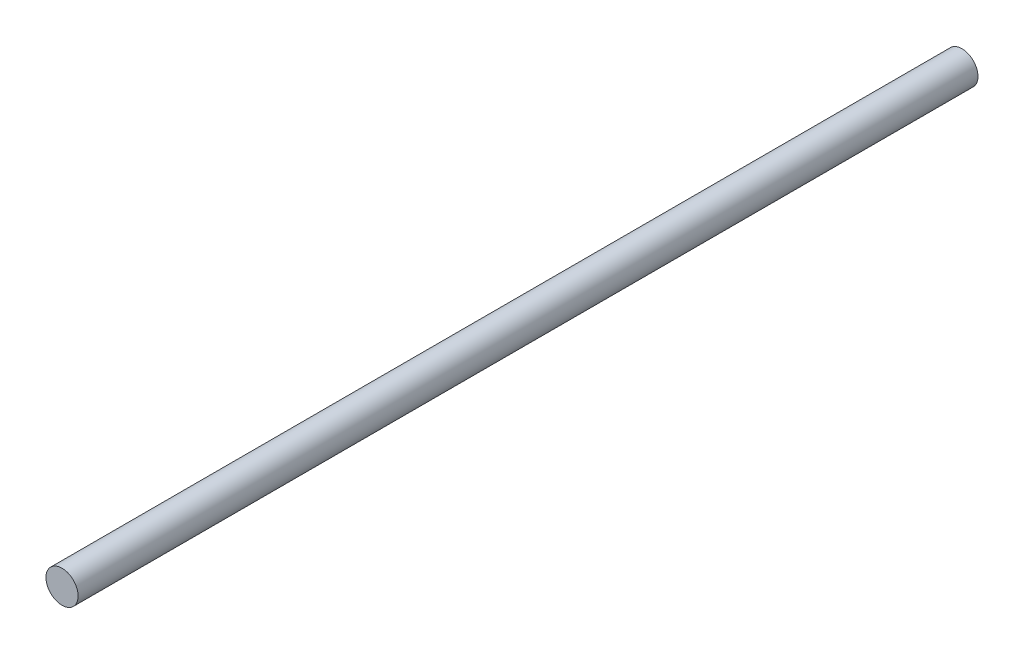
ISO-10303-21;
HEADER;
FILE_DESCRIPTION(('STEP AP214'),'2;1');
FILE_NAME('part.step','',(''),(''),'','','');
FILE_SCHEMA(('AUTOMOTIVE_DESIGN { 1 0 10303 214 1 1 1 1 }'));
ENDSEC;
DATA;
#1=APPLICATION_CONTEXT('core data for automotive mechanical design processes');
#2=APPLICATION_PROTOCOL_DEFINITION('international standard','automotive_design',2000,#1);
#3=PRODUCT_CONTEXT('',#1,'mechanical');
#4=PRODUCT('Part','Part','',(#3));
#5=PRODUCT_RELATED_PRODUCT_CATEGORY('part','',(#4));
#6=PRODUCT_DEFINITION_FORMATION('','',#4);
#7=PRODUCT_DEFINITION_CONTEXT('part definition',#1,'design');
#8=PRODUCT_DEFINITION('design','',#6,#7);
#9=PRODUCT_DEFINITION_SHAPE('','',#8);
#10=(LENGTH_UNIT() NAMED_UNIT(*) SI_UNIT(.MILLI.,.METRE.));
#11=(NAMED_UNIT(*) PLANE_ANGLE_UNIT() SI_UNIT($,.RADIAN.));
#12=(NAMED_UNIT(*) SI_UNIT($,.STERADIAN.) SOLID_ANGLE_UNIT());
#13=UNCERTAINTY_MEASURE_WITH_UNIT(LENGTH_MEASURE(1.E-05),#10,'distance_accuracy_value','');
#14=(GEOMETRIC_REPRESENTATION_CONTEXT(3) GLOBAL_UNCERTAINTY_ASSIGNED_CONTEXT((#13)) GLOBAL_UNIT_ASSIGNED_CONTEXT((#10,
#11,#12)) REPRESENTATION_CONTEXT('',''));
#15=CARTESIAN_POINT('',(0.,0.,0.));
#16=DIRECTION('',(0.,0.,1.));
#17=DIRECTION('',(1.,0.,0.));
#18=AXIS2_PLACEMENT_3D('',#15,#16,#17);
#19=CARTESIAN_POINT('',(0.,0.,700.));
#20=DIRECTION('',(0.,0.,-1.));
#21=DIRECTION('',(-1.,0.,0.));
#22=AXIS2_PLACEMENT_3D('',#19,#20,#21);
#23=CYLINDRICAL_SURFACE('',#22,12.5);
#24=CARTESIAN_POINT('',(0.,0.,700.));
#25=DIRECTION('',(0.,0.,1.));
#26=DIRECTION('',(1.,0.,0.));
#27=AXIS2_PLACEMENT_3D('',#24,#25,#26);
#28=CIRCLE('',#27,12.5);
#29=CARTESIAN_POINT('',(12.5,0.,700.));
#30=VERTEX_POINT('',#29);
#31=EDGE_CURVE('E10',#30,#30,#28,.T.);
#32=ORIENTED_EDGE('',*,*,#31,.F.);
#33=EDGE_LOOP('',(#32));
#34=FACE_BOUND('',#33,.T.);
#35=CARTESIAN_POINT('',(0.,0.,0.));
#36=DIRECTION('',(0.,0.,1.));
#37=DIRECTION('',(1.,0.,0.));
#38=AXIS2_PLACEMENT_3D('',#35,#36,#37);
#39=CIRCLE('',#38,12.5);
#40=CARTESIAN_POINT('',(12.5,0.,0.));
#41=VERTEX_POINT('',#40);
#42=EDGE_CURVE('E17',#41,#41,#39,.T.);
#43=ORIENTED_EDGE('',*,*,#42,.T.);
#44=EDGE_LOOP('',(#43));
#45=FACE_BOUND('',#44,.T.);
#46=ADVANCED_FACE('F14',(#34,#45),#23,.T.);
#47=CARTESIAN_POINT('',(0.,0.,700.));
#48=DIRECTION('',(0.,0.,1.));
#49=DIRECTION('',(1.,0.,0.));
#50=AXIS2_PLACEMENT_3D('',#47,#48,#49);
#51=PLANE('',#50);
#52=ORIENTED_EDGE('',*,*,#31,.T.);
#53=EDGE_LOOP('',(#52));
#54=FACE_BOUND('',#53,.T.);
#55=ADVANCED_FACE('F26',(#54),#51,.T.);
#56=CARTESIAN_POINT('',(0.,0.,0.));
#57=DIRECTION('',(0.,0.,1.));
#58=DIRECTION('',(1.,0.,0.));
#59=AXIS2_PLACEMENT_3D('',#56,#57,#58);
#60=PLANE('',#59);
#61=ORIENTED_EDGE('',*,*,#42,.F.);
#62=EDGE_LOOP('',(#61));
#63=FACE_BOUND('',#62,.T.);
#64=ADVANCED_FACE('F30',(#63),#60,.F.);
#65=CLOSED_SHELL('',(#46,#55,#64));
#66=MANIFOLD_SOLID_BREP('B1',#65);
#67=ADVANCED_BREP_SHAPE_REPRESENTATION('',(#18,#66),#14);
#68=SHAPE_DEFINITION_REPRESENTATION(#9,#67);
ENDSEC;
END-ISO-10303-21;
